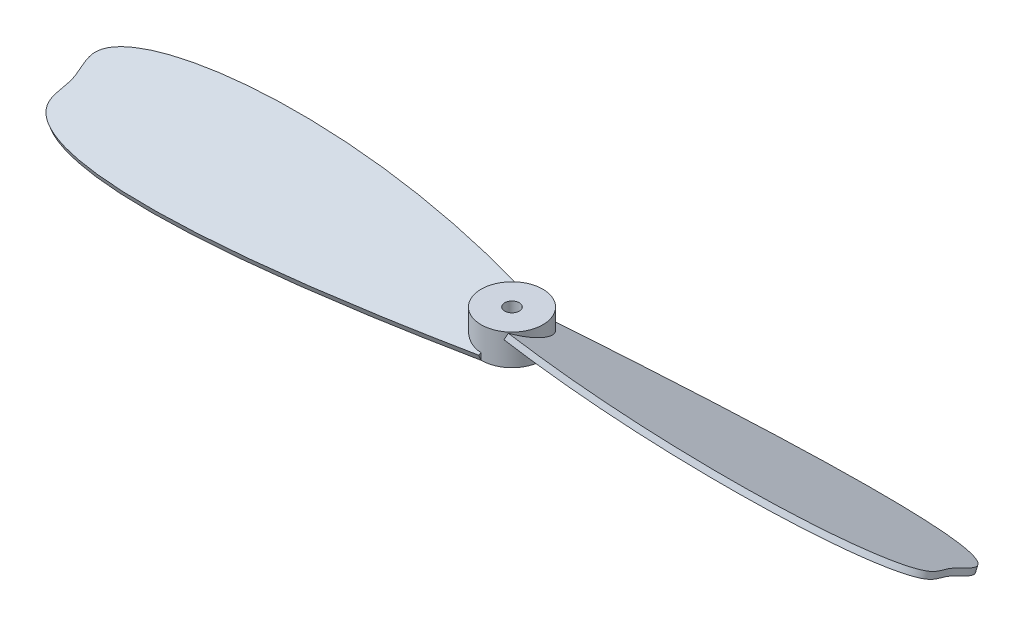
ISO-10303-21;
HEADER;
FILE_DESCRIPTION(('STEP AP214'),'2;1');
FILE_NAME('part.step','',(''),(''),'','','');
FILE_SCHEMA(('AUTOMOTIVE_DESIGN { 1 0 10303 214 1 1 1 1 }'));
ENDSEC;
DATA;
#1=APPLICATION_CONTEXT('core data for automotive mechanical design processes');
#2=APPLICATION_PROTOCOL_DEFINITION('international standard','automotive_design',2000,#1);
#3=PRODUCT_CONTEXT('',#1,'mechanical');
#4=PRODUCT('Part','Part','',(#3));
#5=PRODUCT_RELATED_PRODUCT_CATEGORY('part','',(#4));
#6=PRODUCT_DEFINITION_FORMATION('','',#4);
#7=PRODUCT_DEFINITION_CONTEXT('part definition',#1,'design');
#8=PRODUCT_DEFINITION('design','',#6,#7);
#9=PRODUCT_DEFINITION_SHAPE('','',#8);
#10=(LENGTH_UNIT() NAMED_UNIT(*) SI_UNIT(.MILLI.,.METRE.));
#11=(NAMED_UNIT(*) PLANE_ANGLE_UNIT() SI_UNIT($,.RADIAN.));
#12=(NAMED_UNIT(*) SI_UNIT($,.STERADIAN.) SOLID_ANGLE_UNIT());
#13=UNCERTAINTY_MEASURE_WITH_UNIT(LENGTH_MEASURE(1.E-05),#10,'distance_accuracy_value','');
#14=(GEOMETRIC_REPRESENTATION_CONTEXT(3) GLOBAL_UNCERTAINTY_ASSIGNED_CONTEXT((#13)) GLOBAL_UNIT_ASSIGNED_CONTEXT((#10,
#11,#12)) REPRESENTATION_CONTEXT('',''));
#15=CARTESIAN_POINT('',(0.,0.,0.));
#16=DIRECTION('',(0.,0.,1.));
#17=DIRECTION('',(1.,0.,0.));
#18=AXIS2_PLACEMENT_3D('',#15,#16,#17);
#19=CARTESIAN_POINT('',(0.,6.35,0.));
#20=DIRECTION('',(0.,-1.,0.));
#21=DIRECTION('',(0.,0.,-1.));
#22=AXIS2_PLACEMENT_3D('',#19,#20,#21);
#23=CYLINDRICAL_SURFACE('',#22,1.5);
#24=CARTESIAN_POINT('',(0.,0.,0.));
#25=DIRECTION('',(0.,1.,0.));
#26=DIRECTION('',(0.,0.,1.));
#27=AXIS2_PLACEMENT_3D('',#24,#25,#26);
#28=CIRCLE('',#27,1.5);
#29=CARTESIAN_POINT('',(0.,0.,1.5));
#30=VERTEX_POINT('',#29);
#31=EDGE_CURVE('E165',#30,#30,#28,.T.);
#32=ORIENTED_EDGE('',*,*,#31,.F.);
#33=EDGE_LOOP('',(#32));
#34=FACE_BOUND('',#33,.T.);
#35=CARTESIAN_POINT('',(0.,6.35,0.));
#36=DIRECTION('',(0.,1.,0.));
#37=DIRECTION('',(0.,0.,1.));
#38=AXIS2_PLACEMENT_3D('',#35,#36,#37);
#39=CIRCLE('',#38,1.5);
#40=CARTESIAN_POINT('',(0.,6.35,1.5));
#41=VERTEX_POINT('',#40);
#42=EDGE_CURVE('E168',#41,#41,#39,.T.);
#43=ORIENTED_EDGE('',*,*,#42,.T.);
#44=EDGE_LOOP('',(#43));
#45=FACE_BOUND('',#44,.T.);
#46=ADVANCED_FACE('F41',(#34,#45),#23,.F.);
#47=CARTESIAN_POINT('',(0.,6.35,0.));
#48=DIRECTION('',(0.,-1.,0.));
#49=DIRECTION('',(0.,0.,-1.));
#50=AXIS2_PLACEMENT_3D('',#47,#48,#49);
#51=CYLINDRICAL_SURFACE('',#50,6.35);
#52=CARTESIAN_POINT('',(0.,6.35,0.));
#53=DIRECTION('',(0.,1.,0.));
#54=DIRECTION('',(0.,0.,1.));
#55=AXIS2_PLACEMENT_3D('',#52,#53,#54);
#56=CIRCLE('',#55,6.35);
#57=CARTESIAN_POINT('',(0.,6.35,6.35));
#58=VERTEX_POINT('',#57);
#59=EDGE_CURVE('E48',#58,#58,#56,.T.);
#60=ORIENTED_EDGE('',*,*,#59,.F.);
#61=EDGE_LOOP('',(#60));
#62=FACE_BOUND('',#61,.T.);
#63=CARTESIAN_POINT('',(0.,4.07509276223567,0.));
#64=DIRECTION('',(0.,-0.920504853452443,-0.390731128489268));
#65=DIRECTION('',(0.,-0.390731128489268,0.920504853452443));
#66=AXIS2_PLACEMENT_3D('',#63,#64,#65);
#67=ELLIPSE('',#66,6.89838839652361,6.35);
#68=CARTESIAN_POINT('',(0.,1.37967767930472,6.35));
#69=VERTEX_POINT('',#68);
#70=CARTESIAN_POINT('',(-4.09191235065979,6.13625581223846,-4.85579584769766));
#71=VERTEX_POINT('',#70);
#72=EDGE_CURVE('E92',#69,#71,#67,.T.);
#73=ORIENTED_EDGE('',*,*,#72,.F.);
#74=DIRECTION('',(0.,-1.,0.));
#75=VECTOR('',#74,1.);
#76=CARTESIAN_POINT('',(0.,6.35,6.35));
#77=LINE('',#76,#75);
#78=CARTESIAN_POINT('',(0.,0.,6.35));
#79=VERTEX_POINT('',#78);
#80=EDGE_CURVE('E102',#79,#69,#77,.F.);
#81=ORIENTED_EDGE('',*,*,#80,.F.);
#82=CARTESIAN_POINT('',(0.,0.,0.));
#83=DIRECTION('',(0.,1.,0.));
#84=DIRECTION('',(0.,0.,1.));
#85=AXIS2_PLACEMENT_3D('',#82,#83,#84);
#86=CIRCLE('',#85,6.35);
#87=CARTESIAN_POINT('',(0.,0.,-6.35));
#88=VERTEX_POINT('',#87);
#89=EDGE_CURVE('E176',#79,#88,#86,.T.);
#90=ORIENTED_EDGE('',*,*,#89,.T.);
#91=CARTESIAN_POINT('',(0.,2.69541508293094,0.));
#92=DIRECTION('',(0.,-0.920504853452443,0.390731128489268));
#93=DIRECTION('',(0.,-0.390731128489268,-0.920504853452443));
#94=AXIS2_PLACEMENT_3D('',#91,#92,#93);
#95=ELLIPSE('',#94,6.89838839652361,6.35);
#96=CARTESIAN_POINT('',(3.5866654219282,4.91969273372245,5.24006976586616));
#97=VERTEX_POINT('',#96);
#98=EDGE_CURVE('E184',#88,#97,#95,.T.);
#99=ORIENTED_EDGE('',*,*,#98,.T.);
#100=CARTESIAN_POINT('',(4.09191235065979,6.13625581223846,4.85579584769766));
#101=CARTESIAN_POINT('',(4.06569560834712,6.06814305576104,4.87788811054598));
#102=CARTESIAN_POINT('',(4.03918435976612,6.00010633134789,4.89986590377725));
#103=CARTESIAN_POINT('',(3.98556291447695,5.86420603163065,4.94358019972961));
#104=CARTESIAN_POINT('',(3.95845281938487,5.79634242909734,4.96531674246131));
#105=CARTESIAN_POINT('',(3.90361737793969,5.66079257376728,5.00854169939663));
#106=CARTESIAN_POINT('',(3.87589208683855,5.59310630564938,5.03003013562176));
#107=CARTESIAN_POINT('',(3.81980813097953,5.45791516735637,5.07275156831888));
#108=CARTESIAN_POINT('',(3.79144946195245,5.39041029840739,5.09398456306763));
#109=CARTESIAN_POINT('',(3.73408013371177,5.25558815779919,5.13618671172312));
#110=CARTESIAN_POINT('',(3.70506942076071,5.18827090211958,5.15715584366013));
#111=CARTESIAN_POINT('',(3.64637528466171,5.05383025477798,5.19882121089426));
#112=CARTESIAN_POINT('',(3.61669174343807,4.98670689951092,5.21951739726775));
#113=CARTESIAN_POINT('',(3.5866654219282,4.91969273372245,5.24006976586616));
#114=B_SPLINE_CURVE_WITH_KNOTS('',3,(#100,#101,#102,#103,#104,#105,#106,#107,#108,#109,#110,
#111,#112,#113),.UNSPECIFIED.,.F.,.F.,(4,2,2,2,2,2,4),(0.,0.228762759276293,0.457486994374038,
0.686190769787469,0.914896087212779,1.14362032274276,1.37238501307361),.UNSPECIFIED.);
#115=CARTESIAN_POINT('',(4.09191235065979,6.13625581223846,4.85579584769766));
#116=VERTEX_POINT('',#115);
#117=EDGE_CURVE('E159',#116,#97,#114,.T.);
#118=ORIENTED_EDGE('',*,*,#117,.F.);
#119=CARTESIAN_POINT('',(0.,4.07509276223567,0.));
#120=DIRECTION('',(0.,-0.920504853452443,0.390731128489268));
#121=DIRECTION('',(0.,-0.390731128489268,-0.920504853452443));
#122=AXIS2_PLACEMENT_3D('',#119,#120,#121);
#123=ELLIPSE('',#122,6.89838839652361,6.35);
#124=CARTESIAN_POINT('',(0.,1.37967767930472,-6.35));
#125=VERTEX_POINT('',#124);
#126=EDGE_CURVE('E11',#125,#116,#123,.T.);
#127=ORIENTED_EDGE('',*,*,#126,.F.);
#128=DIRECTION('',(0.,-1.,0.));
#129=VECTOR('',#128,1.);
#130=CARTESIAN_POINT('',(0.,6.35,-6.35));
#131=LINE('',#130,#129);
#132=EDGE_CURVE('E166',#88,#125,#131,.F.);
#133=ORIENTED_EDGE('',*,*,#132,.F.);
#134=EDGE_CURVE('E171',#88,#79,#86,.T.);
#135=ORIENTED_EDGE('',*,*,#134,.T.);
#136=CARTESIAN_POINT('',(0.,2.69541508293094,0.));
#137=DIRECTION('',(0.,-0.920504853452443,-0.390731128489268));
#138=DIRECTION('',(0.,-0.390731128489268,0.920504853452443));
#139=AXIS2_PLACEMENT_3D('',#136,#137,#138);
#140=ELLIPSE('',#139,6.89838839652361,6.35);
#141=CARTESIAN_POINT('',(-3.5866654219282,4.91969273372245,-5.24006976586616));
#142=VERTEX_POINT('',#141);
#143=EDGE_CURVE('E106',#79,#142,#140,.T.);
#144=ORIENTED_EDGE('',*,*,#143,.T.);
#145=CARTESIAN_POINT('',(-4.09191235065979,6.13625581223846,-4.85579584769766));
#146=CARTESIAN_POINT('',(-4.06569560834712,6.06814305576104,-4.87788811054598));
#147=CARTESIAN_POINT('',(-4.03918435976612,6.00010633134789,-4.89986590377725));
#148=CARTESIAN_POINT('',(-3.98556291447695,5.86420603163065,-4.94358019972961));
#149=CARTESIAN_POINT('',(-3.95845281938487,5.79634242909734,-4.96531674246131));
#150=CARTESIAN_POINT('',(-3.90361737793969,5.66079257376728,-5.00854169939663));
#151=CARTESIAN_POINT('',(-3.87589208683855,5.59310630564938,-5.03003013562176));
#152=CARTESIAN_POINT('',(-3.81980813097953,5.45791516735637,-5.07275156831888));
#153=CARTESIAN_POINT('',(-3.79144946195245,5.39041029840739,-5.09398456306763));
#154=CARTESIAN_POINT('',(-3.73408013371176,5.25558815779919,-5.13618671172312));
#155=CARTESIAN_POINT('',(-3.70506942076071,5.18827090211958,-5.15715584366013));
#156=CARTESIAN_POINT('',(-3.64637528466171,5.05383025477797,-5.19882121089426));
#157=CARTESIAN_POINT('',(-3.61669174343807,4.98670689951092,-5.21951739726775));
#158=CARTESIAN_POINT('',(-3.5866654219282,4.91969273372245,-5.24006976586616));
#159=B_SPLINE_CURVE_WITH_KNOTS('',3,(#145,#146,#147,#148,#149,#150,#151,#152,#153,#154,#155,
#156,#157,#158),.UNSPECIFIED.,.F.,.F.,(4,2,2,2,2,2,4),(0.,0.228762759276293,0.457486994374038,
0.686190769787469,0.91489608721278,1.14362032274276,1.37238501307361),.UNSPECIFIED.);
#160=EDGE_CURVE('E115',#71,#142,#159,.T.);
#161=ORIENTED_EDGE('',*,*,#160,.F.);
#162=EDGE_LOOP('',(#73,#81,#90,#99,#118,#127,#133,#135,#144,#161));
#163=FACE_BOUND('',#162,.T.);
#164=ADVANCED_FACE('F126',(#62,#163),#51,.T.);
#165=CARTESIAN_POINT('',(0.,6.35,0.));
#166=DIRECTION('',(0.,1.,0.));
#167=DIRECTION('',(0.,0.,1.));
#168=AXIS2_PLACEMENT_3D('',#165,#166,#167);
#169=PLANE('',#168);
#170=ORIENTED_EDGE('',*,*,#42,.F.);
#171=EDGE_LOOP('',(#170));
#172=FACE_BOUND('',#171,.T.);
#173=ORIENTED_EDGE('',*,*,#59,.T.);
#174=EDGE_LOOP('',(#173));
#175=FACE_BOUND('',#174,.T.);
#176=ADVANCED_FACE('F157',(#172,#175),#169,.T.);
#177=CARTESIAN_POINT('',(0.,0.,0.));
#178=DIRECTION('',(0.,1.,0.));
#179=DIRECTION('',(0.,0.,1.));
#180=AXIS2_PLACEMENT_3D('',#177,#178,#179);
#181=PLANE('',#180);
#182=ORIENTED_EDGE('',*,*,#31,.T.);
#183=EDGE_LOOP('',(#182));
#184=FACE_BOUND('',#183,.T.);
#185=ORIENTED_EDGE('',*,*,#134,.F.);
#186=ORIENTED_EDGE('',*,*,#89,.F.);
#187=EDGE_LOOP('',(#185,#186));
#188=FACE_BOUND('',#187,.T.);
#189=ADVANCED_FACE('F149',(#184,#188),#181,.F.);
#190=CARTESIAN_POINT('',(89.402225831523,3.69502739774438,2.35493903675984));
#191=DIRECTION('',(0.,-0.920504853452443,0.390731128489268));
#192=DIRECTION('',(0.,-0.390731128489268,-0.920504853452443));
#193=AXIS2_PLACEMENT_3D('',#190,#191,#192);
#194=PLANE('',#193);
#195=ORIENTED_EDGE('',*,*,#98,.F.);
#196=CARTESIAN_POINT('',(0.,4.56780773215038,4.41108065241469));
#197=CARTESIAN_POINT('',(43.2367057444646,8.96526828238681,14.770848493306));
#198=CARTESIAN_POINT('',(94.2907228004475,7.34453755571626,10.9526461765159));
#199=CARTESIAN_POINT('',(88.0617265050446,2.28021775989118,-0.978143595766941));
#200=CARTESIAN_POINT('',(92.6161591985136,-1.78400786662267,-10.5528591532313));
#201=CARTESIAN_POINT('',(66.8218542916406,-3.76321877536112,-15.215587855047));
#202=CARTESIAN_POINT('',(-3.71069723590599E-13,0.,-6.34999999999995));
#203=B_SPLINE_CURVE_WITH_KNOTS('',3,(#196,#197,#198,#199,#200,#201,#202),.UNSPECIFIED.,.F.,.F.,
(4,1,1,1,4),(0.,0.469261671036633,0.561898962599446,0.654536254162259,1.),.UNSPECIFIED.);
#204=EDGE_CURVE('E61',#97,#88,#203,.T.);
#205=ORIENTED_EDGE('',*,*,#204,.F.);
#206=EDGE_LOOP('',(#195,#205));
#207=FACE_BOUND('',#206,.T.);
#208=ADVANCED_FACE('F145',(#207),#194,.T.);
#209=CARTESIAN_POINT('',(89.402225831523,4.86406856162898,1.85871050357847));
#210=DIRECTION('',(0.,-0.920504853452443,0.390731128489268));
#211=DIRECTION('',(0.,-0.390731128489268,-0.920504853452443));
#212=AXIS2_PLACEMENT_3D('',#209,#210,#211);
#213=PLANE('',#212);
#214=DIRECTION('',(0.,0.390731128489268,0.920504853452443));
#215=VECTOR('',#214,1.);
#216=CARTESIAN_POINT('',(0.,1.1690411638846,-6.84622853318137));
#217=LINE('',#216,#215);
#218=CARTESIAN_POINT('',(0.,1.1690411638846,-6.84622853318137));
#219=VERTEX_POINT('',#218);
#220=EDGE_CURVE('E193',#219,#125,#217,.T.);
#221=ORIENTED_EDGE('',*,*,#220,.T.);
#222=ORIENTED_EDGE('',*,*,#126,.T.);
#223=CARTESIAN_POINT('',(0.,5.73684889603498,3.91485211923332));
#224=CARTESIAN_POINT('',(43.2367057444646,10.1343094462714,14.2746199601246));
#225=CARTESIAN_POINT('',(94.2907228004475,8.51357871960086,10.4564176433345));
#226=CARTESIAN_POINT('',(88.0617265050446,3.44925892377578,-1.47437212894831));
#227=CARTESIAN_POINT('',(92.6161591985136,-0.614966702738065,-11.0490876864126));
#228=CARTESIAN_POINT('',(66.8218542916406,-2.59417761147652,-15.7118163882284));
#229=CARTESIAN_POINT('',(-3.71069723590599E-13,1.16904116388462,-6.84622853318132));
#230=B_SPLINE_CURVE_WITH_KNOTS('',3,(#223,#224,#225,#226,#227,#228,#229),.UNSPECIFIED.,.F.,.F.,
(4,1,1,1,4),(0.,0.469261671036633,0.561898962599446,0.654536254162259,1.),.UNSPECIFIED.);
#231=EDGE_CURVE('E121',#116,#219,#230,.T.);
#232=ORIENTED_EDGE('',*,*,#231,.T.);
#233=EDGE_LOOP('',(#221,#222,#232));
#234=FACE_BOUND('',#233,.T.);
#235=ADVANCED_FACE('F135',(#234),#213,.F.);
#236=CARTESIAN_POINT('',(0.,1.1690411638846,-6.84622853318137));
#237=DIRECTION('',(1.,0.,0.));
#238=DIRECTION('',(0.,0.,-1.));
#239=AXIS2_PLACEMENT_3D('',#236,#237,#238);
#240=PLANE('',#239);
#241=DIRECTION('',(0.,-0.920504853452443,0.390731128489268));
#242=VECTOR('',#241,1.);
#243=CARTESIAN_POINT('',(0.,1.1690411638846,-6.84622853318137));
#244=LINE('',#243,#242);
#245=EDGE_CURVE('E186',#219,#88,#244,.T.);
#246=ORIENTED_EDGE('',*,*,#245,.T.);
#247=ORIENTED_EDGE('',*,*,#132,.T.);
#248=ORIENTED_EDGE('',*,*,#220,.F.);
#249=EDGE_LOOP('',(#246,#247,#248));
#250=FACE_BOUND('',#249,.T.);
#251=ADVANCED_FACE('F144',(#250),#240,.F.);
#252=DIRECTION('',(0.,-0.920504853452443,0.390731128489268));
#253=VECTOR('',#252,1.);
#254=SURFACE_OF_LINEAR_EXTRUSION('',#230,#253);
#255=ORIENTED_EDGE('',*,*,#231,.F.);
#256=ORIENTED_EDGE('',*,*,#117,.T.);
#257=ORIENTED_EDGE('',*,*,#204,.T.);
#258=ORIENTED_EDGE('',*,*,#245,.F.);
#259=EDGE_LOOP('',(#255,#256,#257,#258));
#260=FACE_BOUND('',#259,.T.);
#261=ADVANCED_FACE('F133',(#260),#254,.F.);
#262=CARTESIAN_POINT('',(0.,5.73684889603498,-3.91485211923332));
#263=CARTESIAN_POINT('',(-43.2367057444646,10.1343094462714,-14.2746199601246));
#264=CARTESIAN_POINT('',(-94.2907228004475,8.51357871960086,-10.4564176433345));
#265=CARTESIAN_POINT('',(-88.0617265050446,3.44925892377578,1.47437212894831));
#266=CARTESIAN_POINT('',(-92.6161591985136,-0.614966702738065,11.0490876864126));
#267=CARTESIAN_POINT('',(-66.8218542916406,-2.59417761147652,15.7118163882284));
#268=CARTESIAN_POINT('',(3.71069723590599E-13,1.16904116388462,6.84622853318132));
#269=B_SPLINE_CURVE_WITH_KNOTS('',3,(#262,#263,#264,#265,#266,#267,#268),.UNSPECIFIED.,.F.,.F.,
(4,1,1,1,4),(0.,0.469261671036633,0.561898962599446,0.654536254162259,1.),.UNSPECIFIED.);
#270=DIRECTION('',(0.,-0.920504853452443,-0.390731128489268));
#271=VECTOR('',#270,1.);
#272=SURFACE_OF_LINEAR_EXTRUSION('',#269,#271);
#273=CARTESIAN_POINT('',(0.,1.1690411638846,6.84622853318137));
#274=VERTEX_POINT('',#273);
#275=EDGE_CURVE('E87',#71,#274,#269,.T.);
#276=ORIENTED_EDGE('',*,*,#275,.F.);
#277=ORIENTED_EDGE('',*,*,#160,.T.);
#278=CARTESIAN_POINT('',(0.,4.56780773215038,-4.41108065241469));
#279=CARTESIAN_POINT('',(-43.2367057444646,8.96526828238681,-14.770848493306));
#280=CARTESIAN_POINT('',(-94.2907228004475,7.34453755571626,-10.9526461765159));
#281=CARTESIAN_POINT('',(-88.0617265050446,2.28021775989118,0.978143595766941));
#282=CARTESIAN_POINT('',(-92.6161591985136,-1.78400786662267,10.5528591532313));
#283=CARTESIAN_POINT('',(-66.8218542916406,-3.76321877536112,15.215587855047));
#284=CARTESIAN_POINT('',(3.71069723590599E-13,0.,6.34999999999995));
#285=B_SPLINE_CURVE_WITH_KNOTS('',3,(#278,#279,#280,#281,#282,#283,#284),.UNSPECIFIED.,.F.,.F.,
(4,1,1,1,4),(0.,0.469261671036633,0.561898962599446,0.654536254162259,1.),.UNSPECIFIED.);
#286=EDGE_CURVE('E54',#142,#79,#285,.T.);
#287=ORIENTED_EDGE('',*,*,#286,.T.);
#288=DIRECTION('',(0.,-0.920504853452443,-0.390731128489268));
#289=VECTOR('',#288,1.);
#290=CARTESIAN_POINT('',(0.,1.1690411638846,6.84622853318137));
#291=LINE('',#290,#289);
#292=EDGE_CURVE('E100',#274,#79,#291,.T.);
#293=ORIENTED_EDGE('',*,*,#292,.F.);
#294=EDGE_LOOP('',(#276,#277,#287,#293));
#295=FACE_BOUND('',#294,.T.);
#296=ADVANCED_FACE('F104',(#295),#272,.F.);
#297=CARTESIAN_POINT('',(-89.402225831523,4.86406856162898,-1.85871050357847));
#298=DIRECTION('',(0.,-0.920504853452443,-0.390731128489268));
#299=DIRECTION('',(0.,-0.390731128489268,0.920504853452443));
#300=AXIS2_PLACEMENT_3D('',#297,#298,#299);
#301=PLANE('',#300);
#302=DIRECTION('',(0.,0.390731128489268,-0.920504853452443));
#303=VECTOR('',#302,1.);
#304=CARTESIAN_POINT('',(0.,1.1690411638846,6.84622853318137));
#305=LINE('',#304,#303);
#306=EDGE_CURVE('E90',#274,#69,#305,.T.);
#307=ORIENTED_EDGE('',*,*,#306,.T.);
#308=ORIENTED_EDGE('',*,*,#72,.T.);
#309=ORIENTED_EDGE('',*,*,#275,.T.);
#310=EDGE_LOOP('',(#307,#308,#309));
#311=FACE_BOUND('',#310,.T.);
#312=ADVANCED_FACE('F89',(#311),#301,.F.);
#313=CARTESIAN_POINT('',(-89.402225831523,3.69502739774438,-2.35493903675984));
#314=DIRECTION('',(0.,-0.920504853452443,-0.390731128489268));
#315=DIRECTION('',(0.,-0.390731128489268,0.920504853452443));
#316=AXIS2_PLACEMENT_3D('',#313,#314,#315);
#317=PLANE('',#316);
#318=ORIENTED_EDGE('',*,*,#143,.F.);
#319=ORIENTED_EDGE('',*,*,#286,.F.);
#320=EDGE_LOOP('',(#318,#319));
#321=FACE_BOUND('',#320,.T.);
#322=ADVANCED_FACE('F256',(#321),#317,.T.);
#323=CARTESIAN_POINT('',(0.,1.1690411638846,6.84622853318137));
#324=DIRECTION('',(-1.,0.,0.));
#325=DIRECTION('',(0.,0.,1.));
#326=AXIS2_PLACEMENT_3D('',#323,#324,#325);
#327=PLANE('',#326);
#328=ORIENTED_EDGE('',*,*,#292,.T.);
#329=ORIENTED_EDGE('',*,*,#80,.T.);
#330=ORIENTED_EDGE('',*,*,#306,.F.);
#331=EDGE_LOOP('',(#328,#329,#330));
#332=FACE_BOUND('',#331,.T.);
#333=ADVANCED_FACE('F99',(#332),#327,.F.);
#334=CLOSED_SHELL('',(#46,#164,#176,#189,#208,#235,#251,#261,#296,#312,#322,#333));
#335=MANIFOLD_SOLID_BREP('B2',#334);
#336=ADVANCED_BREP_SHAPE_REPRESENTATION('',(#18,#335),#14);
#337=SHAPE_DEFINITION_REPRESENTATION(#9,#336);
ENDSEC;
END-ISO-10303-21;
